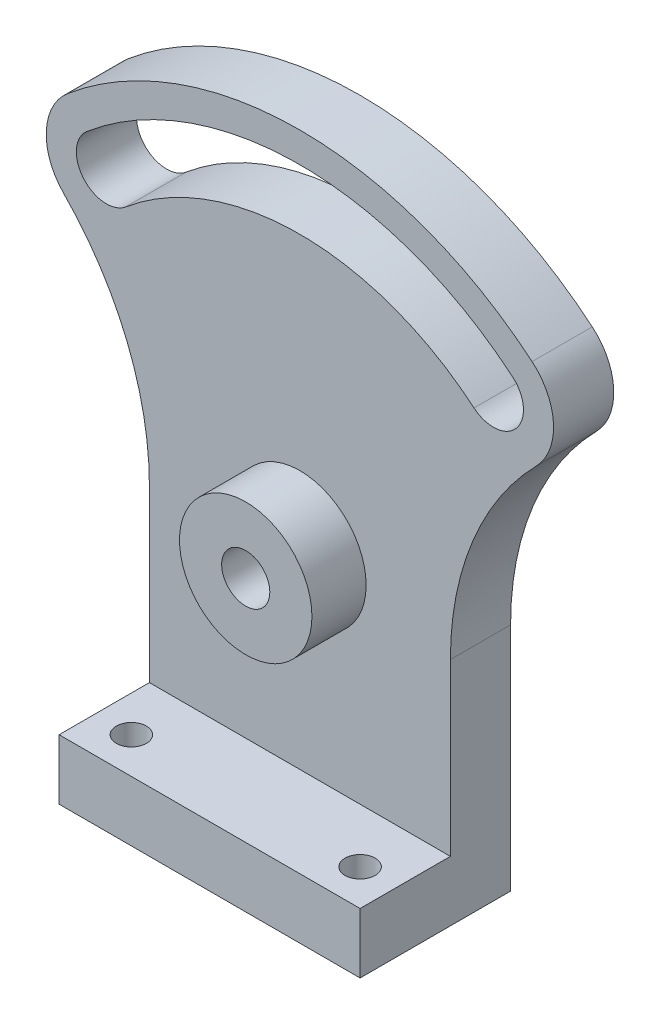
ISO-10303-21;
HEADER;
FILE_DESCRIPTION(('STEP AP214'),'2;1');
FILE_NAME('part.step','',(''),(''),'','','');
FILE_SCHEMA(('AUTOMOTIVE_DESIGN { 1 0 10303 214 1 1 1 1 }'));
ENDSEC;
DATA;
#1=APPLICATION_CONTEXT('core data for automotive mechanical design processes');
#2=APPLICATION_PROTOCOL_DEFINITION('international standard','automotive_design',2000,#1);
#3=PRODUCT_CONTEXT('',#1,'mechanical');
#4=PRODUCT('Part','Part','',(#3));
#5=PRODUCT_RELATED_PRODUCT_CATEGORY('part','',(#4));
#6=PRODUCT_DEFINITION_FORMATION('','',#4);
#7=PRODUCT_DEFINITION_CONTEXT('part definition',#1,'design');
#8=PRODUCT_DEFINITION('design','',#6,#7);
#9=PRODUCT_DEFINITION_SHAPE('','',#8);
#10=(LENGTH_UNIT() NAMED_UNIT(*) SI_UNIT(.MILLI.,.METRE.));
#11=(NAMED_UNIT(*) PLANE_ANGLE_UNIT() SI_UNIT($,.RADIAN.));
#12=(NAMED_UNIT(*) SI_UNIT($,.STERADIAN.) SOLID_ANGLE_UNIT());
#13=UNCERTAINTY_MEASURE_WITH_UNIT(LENGTH_MEASURE(1.E-05),#10,'distance_accuracy_value','');
#14=(GEOMETRIC_REPRESENTATION_CONTEXT(3) GLOBAL_UNCERTAINTY_ASSIGNED_CONTEXT((#13)) GLOBAL_UNIT_ASSIGNED_CONTEXT((#10,
#11,#12)) REPRESENTATION_CONTEXT('',''));
#15=CARTESIAN_POINT('',(0.,0.,0.));
#16=DIRECTION('',(0.,0.,1.));
#17=DIRECTION('',(1.,0.,0.));
#18=AXIS2_PLACEMENT_3D('',#15,#16,#17);
#19=CARTESIAN_POINT('',(0.,-21.,25.));
#20=DIRECTION('',(0.,1.,0.));
#21=DIRECTION('',(0.,0.,1.));
#22=AXIS2_PLACEMENT_3D('',#19,#20,#21);
#23=PLANE('',#22);
#24=CARTESIAN_POINT('',(-19.,-21.,19.));
#25=DIRECTION('',(0.,1.,0.));
#26=DIRECTION('',(0.,0.,1.));
#27=AXIS2_PLACEMENT_3D('',#24,#25,#26);
#28=CIRCLE('',#27,2.49999999999999);
#29=CARTESIAN_POINT('',(-19.,-21.,21.5));
#30=VERTEX_POINT('',#29);
#31=EDGE_CURVE('E321',#30,#30,#28,.T.);
#32=ORIENTED_EDGE('',*,*,#31,.T.);
#33=EDGE_LOOP('',(#32));
#34=FACE_BOUND('',#33,.T.);
#35=CARTESIAN_POINT('',(19.,-21.,19.));
#36=DIRECTION('',(0.,1.,0.));
#37=DIRECTION('',(0.,0.,1.));
#38=AXIS2_PLACEMENT_3D('',#35,#36,#37);
#39=CIRCLE('',#38,2.49999999999999);
#40=CARTESIAN_POINT('',(19.,-21.,21.5));
#41=VERTEX_POINT('',#40);
#42=EDGE_CURVE('E315',#41,#41,#39,.T.);
#43=ORIENTED_EDGE('',*,*,#42,.T.);
#44=EDGE_LOOP('',(#43));
#45=FACE_BOUND('',#44,.T.);
#46=DIRECTION('',(1.,0.,0.));
#47=VECTOR('',#46,1.);
#48=CARTESIAN_POINT('',(0.,-21.,0.));
#49=LINE('',#48,#47);
#50=CARTESIAN_POINT('',(-25.,-21.,0.));
#51=VERTEX_POINT('',#50);
#52=CARTESIAN_POINT('',(25.,-21.,0.));
#53=VERTEX_POINT('',#52);
#54=EDGE_CURVE('E220',#51,#53,#49,.T.);
#55=ORIENTED_EDGE('',*,*,#54,.T.);
#56=DIRECTION('',(0.,0.,-1.));
#57=VECTOR('',#56,1.);
#58=CARTESIAN_POINT('',(25.,-21.,25.));
#59=LINE('',#58,#57);
#60=CARTESIAN_POINT('',(25.,-21.,25.));
#61=VERTEX_POINT('',#60);
#62=EDGE_CURVE('E75',#61,#53,#59,.T.);
#63=ORIENTED_EDGE('',*,*,#62,.F.);
#64=DIRECTION('',(1.,0.,0.));
#65=VECTOR('',#64,1.);
#66=CARTESIAN_POINT('',(0.,-21.,25.));
#67=LINE('',#66,#65);
#68=CARTESIAN_POINT('',(-25.,-21.,25.));
#69=VERTEX_POINT('',#68);
#70=EDGE_CURVE('E211',#69,#61,#67,.T.);
#71=ORIENTED_EDGE('',*,*,#70,.F.);
#72=DIRECTION('',(0.,0.,-1.));
#73=VECTOR('',#72,1.);
#74=CARTESIAN_POINT('',(-25.,-21.,25.));
#75=LINE('',#74,#73);
#76=EDGE_CURVE('E91',#69,#51,#75,.T.);
#77=ORIENTED_EDGE('',*,*,#76,.T.);
#78=EDGE_LOOP('',(#55,#63,#71,#77));
#79=FACE_BOUND('',#78,.T.);
#80=ADVANCED_FACE('F68',(#34,#45,#79),#23,.F.);
#81=CARTESIAN_POINT('',(25.,0.,25.));
#82=DIRECTION('',(-1.,0.,0.));
#83=DIRECTION('',(0.,-1.,0.));
#84=AXIS2_PLACEMENT_3D('',#81,#82,#83);
#85=PLANE('',#84);
#86=DIRECTION('',(0.,1.,0.));
#87=VECTOR('',#86,1.);
#88=CARTESIAN_POINT('',(25.,0.,0.));
#89=LINE('',#88,#87);
#90=CARTESIAN_POINT('',(25.,17.3145180661476,0.));
#91=VERTEX_POINT('',#90);
#92=EDGE_CURVE('E222',#53,#91,#89,.T.);
#93=ORIENTED_EDGE('',*,*,#92,.T.);
#94=DIRECTION('',(0.,0.,-1.));
#95=VECTOR('',#94,1.);
#96=CARTESIAN_POINT('',(25.,17.3145180661476,10.));
#97=LINE('',#96,#95);
#98=CARTESIAN_POINT('',(25.,17.3145180661476,10.));
#99=VERTEX_POINT('',#98);
#100=EDGE_CURVE('E247',#99,#91,#97,.T.);
#101=ORIENTED_EDGE('',*,*,#100,.F.);
#102=DIRECTION('',(0.,1.,0.));
#103=VECTOR('',#102,1.);
#104=CARTESIAN_POINT('',(25.,0.,10.));
#105=LINE('',#104,#103);
#106=CARTESIAN_POINT('',(25.,-11.,10.));
#107=VERTEX_POINT('',#106);
#108=EDGE_CURVE('E194',#107,#99,#105,.T.);
#109=ORIENTED_EDGE('',*,*,#108,.F.);
#110=DIRECTION('',(0.,0.,-1.));
#111=VECTOR('',#110,1.);
#112=CARTESIAN_POINT('',(25.,-11.,25.));
#113=LINE('',#112,#111);
#114=CARTESIAN_POINT('',(25.,-11.,25.));
#115=VERTEX_POINT('',#114);
#116=EDGE_CURVE('E229',#115,#107,#113,.T.);
#117=ORIENTED_EDGE('',*,*,#116,.F.);
#118=DIRECTION('',(0.,1.,0.));
#119=VECTOR('',#118,1.);
#120=CARTESIAN_POINT('',(25.,0.,25.));
#121=LINE('',#120,#119);
#122=EDGE_CURVE('E111',#61,#115,#121,.T.);
#123=ORIENTED_EDGE('',*,*,#122,.F.);
#124=ORIENTED_EDGE('',*,*,#62,.T.);
#125=EDGE_LOOP('',(#93,#101,#109,#117,#123,#124));
#126=FACE_BOUND('',#125,.T.);
#127=ADVANCED_FACE('F231',(#126),#85,.F.);
#128=CARTESIAN_POINT('',(0.,-11.,25.));
#129=DIRECTION('',(0.,1.,0.));
#130=DIRECTION('',(0.,0.,1.));
#131=AXIS2_PLACEMENT_3D('',#128,#129,#130);
#132=PLANE('',#131);
#133=CARTESIAN_POINT('',(-19.,-11.,19.));
#134=DIRECTION('',(0.,1.,0.));
#135=DIRECTION('',(0.,0.,1.));
#136=AXIS2_PLACEMENT_3D('',#133,#134,#135);
#137=CIRCLE('',#136,2.49999999999998);
#138=CARTESIAN_POINT('',(-19.,-11.,21.5));
#139=VERTEX_POINT('',#138);
#140=EDGE_CURVE('E324',#139,#139,#137,.T.);
#141=ORIENTED_EDGE('',*,*,#140,.F.);
#142=EDGE_LOOP('',(#141));
#143=FACE_BOUND('',#142,.T.);
#144=CARTESIAN_POINT('',(19.,-11.,19.));
#145=DIRECTION('',(0.,1.,0.));
#146=DIRECTION('',(0.,0.,1.));
#147=AXIS2_PLACEMENT_3D('',#144,#145,#146);
#148=CIRCLE('',#147,2.49999999999998);
#149=CARTESIAN_POINT('',(19.,-11.,21.5));
#150=VERTEX_POINT('',#149);
#151=EDGE_CURVE('E318',#150,#150,#148,.T.);
#152=ORIENTED_EDGE('',*,*,#151,.F.);
#153=EDGE_LOOP('',(#152));
#154=FACE_BOUND('',#153,.T.);
#155=DIRECTION('',(1.,0.,0.));
#156=VECTOR('',#155,1.);
#157=CARTESIAN_POINT('',(0.,-11.,10.));
#158=LINE('',#157,#156);
#159=CARTESIAN_POINT('',(-25.,-11.,10.));
#160=VERTEX_POINT('',#159);
#161=EDGE_CURVE('E82',#160,#107,#158,.T.);
#162=ORIENTED_EDGE('',*,*,#161,.F.);
#163=DIRECTION('',(0.,0.,-1.));
#164=VECTOR('',#163,1.);
#165=CARTESIAN_POINT('',(-25.,-11.,25.));
#166=LINE('',#165,#164);
#167=CARTESIAN_POINT('',(-25.,-11.,25.));
#168=VERTEX_POINT('',#167);
#169=EDGE_CURVE('E227',#168,#160,#166,.T.);
#170=ORIENTED_EDGE('',*,*,#169,.F.);
#171=DIRECTION('',(1.,0.,0.));
#172=VECTOR('',#171,1.);
#173=CARTESIAN_POINT('',(0.,-11.,25.));
#174=LINE('',#173,#172);
#175=EDGE_CURVE('E215',#168,#115,#174,.T.);
#176=ORIENTED_EDGE('',*,*,#175,.T.);
#177=ORIENTED_EDGE('',*,*,#116,.T.);
#178=EDGE_LOOP('',(#162,#170,#176,#177));
#179=FACE_BOUND('',#178,.T.);
#180=ADVANCED_FACE('F330',(#143,#154,#179),#132,.T.);
#181=CARTESIAN_POINT('',(-25.,0.,25.));
#182=DIRECTION('',(-1.,0.,0.));
#183=DIRECTION('',(0.,-1.,0.));
#184=AXIS2_PLACEMENT_3D('',#181,#182,#183);
#185=PLANE('',#184);
#186=DIRECTION('',(0.,1.,0.));
#187=VECTOR('',#186,1.);
#188=CARTESIAN_POINT('',(-25.,0.,0.));
#189=LINE('',#188,#187);
#190=CARTESIAN_POINT('',(-25.,17.3145180661476,0.));
#191=VERTEX_POINT('',#190);
#192=EDGE_CURVE('E213',#51,#191,#189,.T.);
#193=ORIENTED_EDGE('',*,*,#192,.F.);
#194=ORIENTED_EDGE('',*,*,#76,.F.);
#195=DIRECTION('',(0.,1.,0.));
#196=VECTOR('',#195,1.);
#197=CARTESIAN_POINT('',(-25.,0.,25.));
#198=LINE('',#197,#196);
#199=EDGE_CURVE('E218',#69,#168,#198,.T.);
#200=ORIENTED_EDGE('',*,*,#199,.T.);
#201=ORIENTED_EDGE('',*,*,#169,.T.);
#202=DIRECTION('',(0.,1.,0.));
#203=VECTOR('',#202,1.);
#204=CARTESIAN_POINT('',(-25.,0.,10.));
#205=LINE('',#204,#203);
#206=CARTESIAN_POINT('',(-25.,17.3145180661476,10.));
#207=VERTEX_POINT('',#206);
#208=EDGE_CURVE('E242',#160,#207,#205,.T.);
#209=ORIENTED_EDGE('',*,*,#208,.T.);
#210=DIRECTION('',(0.,0.,-1.));
#211=VECTOR('',#210,1.);
#212=CARTESIAN_POINT('',(-25.,17.3145180661476,10.));
#213=LINE('',#212,#211);
#214=EDGE_CURVE('E239',#207,#191,#213,.T.);
#215=ORIENTED_EDGE('',*,*,#214,.T.);
#216=EDGE_LOOP('',(#193,#194,#200,#201,#209,#215));
#217=FACE_BOUND('',#216,.T.);
#218=ADVANCED_FACE('F237',(#217),#185,.T.);
#219=CARTESIAN_POINT('',(0.,0.,25.));
#220=DIRECTION('',(0.,0.,1.));
#221=DIRECTION('',(1.,0.,0.));
#222=AXIS2_PLACEMENT_3D('',#219,#220,#221);
#223=PLANE('',#222);
#224=ORIENTED_EDGE('',*,*,#70,.T.);
#225=ORIENTED_EDGE('',*,*,#122,.T.);
#226=ORIENTED_EDGE('',*,*,#175,.F.);
#227=ORIENTED_EDGE('',*,*,#199,.F.);
#228=EDGE_LOOP('',(#224,#225,#226,#227));
#229=FACE_BOUND('',#228,.T.);
#230=ADVANCED_FACE('F363',(#229),#223,.T.);
#231=CARTESIAN_POINT('',(0.,0.,0.));
#232=DIRECTION('',(0.,0.,1.));
#233=DIRECTION('',(1.,0.,0.));
#234=AXIS2_PLACEMENT_3D('',#231,#232,#233);
#235=PLANE('',#234);
#236=ORIENTED_EDGE('',*,*,#54,.F.);
#237=ORIENTED_EDGE('',*,*,#192,.T.);
#238=CARTESIAN_POINT('',(-75.,17.3145180661476,0.));
#239=DIRECTION('',(0.,0.,1.));
#240=DIRECTION('',(1.,0.,0.));
#241=AXIS2_PLACEMENT_3D('',#238,#239,#240);
#242=CIRCLE('',#241,50.);
#243=CARTESIAN_POINT('',(-39.2828170702725,52.3042714743153,0.));
#244=VERTEX_POINT('',#243);
#245=EDGE_CURVE('E249',#191,#244,#242,.T.);
#246=ORIENTED_EDGE('',*,*,#245,.T.);
#247=CARTESIAN_POINT('',(-32.139380484327,59.3022221559488,0.));
#248=DIRECTION('',(0.,0.,1.));
#249=DIRECTION('',(1.,0.,0.));
#250=AXIS2_PLACEMENT_3D('',#247,#248,#249);
#251=CIRCLE('',#250,10.);
#252=CARTESIAN_POINT('',(-38.5672565811925,66.9626665871386,0.));
#253=VERTEX_POINT('',#252);
#254=EDGE_CURVE('E255',#253,#244,#251,.T.);
#255=ORIENTED_EDGE('',*,*,#254,.F.);
#256=CARTESIAN_POINT('',(0.,21.,0.));
#257=DIRECTION('',(0.,0.,1.));
#258=DIRECTION('',(1.,0.,0.));
#259=AXIS2_PLACEMENT_3D('',#256,#257,#258);
#260=CIRCLE('',#259,60.);
#261=CARTESIAN_POINT('',(38.5672565811925,66.9626665871386,0.));
#262=VERTEX_POINT('',#261);
#263=EDGE_CURVE('E260',#262,#253,#260,.T.);
#264=ORIENTED_EDGE('',*,*,#263,.F.);
#265=CARTESIAN_POINT('',(32.139380484327,59.3022221559488,0.));
#266=DIRECTION('',(0.,0.,1.));
#267=DIRECTION('',(1.,0.,0.));
#268=AXIS2_PLACEMENT_3D('',#265,#266,#267);
#269=CIRCLE('',#268,10.);
#270=CARTESIAN_POINT('',(39.2828170702725,52.3042714743153,0.));
#271=VERTEX_POINT('',#270);
#272=EDGE_CURVE('E285',#271,#262,#269,.T.);
#273=ORIENTED_EDGE('',*,*,#272,.F.);
#274=CARTESIAN_POINT('',(75.,17.3145180661476,0.));
#275=DIRECTION('',(0.,0.,1.));
#276=DIRECTION('',(1.,0.,0.));
#277=AXIS2_PLACEMENT_3D('',#274,#275,#276);
#278=CIRCLE('',#277,50.);
#279=EDGE_CURVE('E202',#91,#271,#278,.F.);
#280=ORIENTED_EDGE('',*,*,#279,.F.);
#281=ORIENTED_EDGE('',*,*,#92,.F.);
#282=EDGE_LOOP('',(#236,#237,#246,#255,#264,#273,#280,#281));
#283=FACE_BOUND('',#282,.T.);
#284=CARTESIAN_POINT('',(-32.139380484327,59.3022221559488,0.));
#285=DIRECTION('',(0.,0.,1.));
#286=DIRECTION('',(1.,0.,0.));
#287=AXIS2_PLACEMENT_3D('',#284,#285,#286);
#288=CIRCLE('',#287,5.);
#289=CARTESIAN_POINT('',(-35.3533185327598,63.1324443715437,0.));
#290=VERTEX_POINT('',#289);
#291=CARTESIAN_POINT('',(-28.9254424358943,55.471999940354,0.));
#292=VERTEX_POINT('',#291);
#293=EDGE_CURVE('E254',#290,#292,#288,.T.);
#294=ORIENTED_EDGE('',*,*,#293,.T.);
#295=CARTESIAN_POINT('',(0.,21.,0.));
#296=DIRECTION('',(0.,0.,1.));
#297=DIRECTION('',(1.,0.,0.));
#298=AXIS2_PLACEMENT_3D('',#295,#296,#297);
#299=CIRCLE('',#298,45.);
#300=CARTESIAN_POINT('',(28.9254424358943,55.4719999403539,0.));
#301=VERTEX_POINT('',#300);
#302=EDGE_CURVE('E198',#301,#292,#299,.T.);
#303=ORIENTED_EDGE('',*,*,#302,.F.);
#304=CARTESIAN_POINT('',(32.139380484327,59.3022221559488,0.));
#305=DIRECTION('',(0.,0.,1.));
#306=DIRECTION('',(1.,0.,0.));
#307=AXIS2_PLACEMENT_3D('',#304,#305,#306);
#308=CIRCLE('',#307,5.);
#309=CARTESIAN_POINT('',(35.3533185327598,63.1324443715437,0.));
#310=VERTEX_POINT('',#309);
#311=EDGE_CURVE('E266',#301,#310,#308,.T.);
#312=ORIENTED_EDGE('',*,*,#311,.T.);
#313=CARTESIAN_POINT('',(0.,21.,0.));
#314=DIRECTION('',(0.,0.,1.));
#315=DIRECTION('',(1.,0.,0.));
#316=AXIS2_PLACEMENT_3D('',#313,#314,#315);
#317=CIRCLE('',#316,55.);
#318=EDGE_CURVE('E258',#310,#290,#317,.T.);
#319=ORIENTED_EDGE('',*,*,#318,.T.);
#320=EDGE_LOOP('',(#294,#303,#312,#319));
#321=FACE_BOUND('',#320,.T.);
#322=ADVANCED_FACE('F233',(#283,#321),#235,.F.);
#323=CARTESIAN_POINT('',(-32.139380484327,59.3022221559488,10.));
#324=DIRECTION('',(0.,0.,-1.));
#325=DIRECTION('',(-1.,0.,0.));
#326=AXIS2_PLACEMENT_3D('',#323,#324,#325);
#327=CYLINDRICAL_SURFACE('',#326,5.);
#328=ORIENTED_EDGE('',*,*,#293,.F.);
#329=DIRECTION('',(0.,0.,-1.));
#330=VECTOR('',#329,1.);
#331=CARTESIAN_POINT('',(-35.3533185327598,63.1324443715437,10.));
#332=LINE('',#331,#330);
#333=CARTESIAN_POINT('',(-35.3533185327598,63.1324443715437,10.));
#334=VERTEX_POINT('',#333);
#335=EDGE_CURVE('E223',#334,#290,#332,.T.);
#336=ORIENTED_EDGE('',*,*,#335,.F.);
#337=CARTESIAN_POINT('',(-32.139380484327,59.3022221559488,10.));
#338=DIRECTION('',(0.,0.,1.));
#339=DIRECTION('',(1.,0.,0.));
#340=AXIS2_PLACEMENT_3D('',#337,#338,#339);
#341=CIRCLE('',#340,5.);
#342=CARTESIAN_POINT('',(-28.9254424358943,55.471999940354,10.));
#343=VERTEX_POINT('',#342);
#344=EDGE_CURVE('E297',#334,#343,#341,.T.);
#345=ORIENTED_EDGE('',*,*,#344,.T.);
#346=DIRECTION('',(0.,0.,-1.));
#347=VECTOR('',#346,1.);
#348=CARTESIAN_POINT('',(-28.9254424358943,55.471999940354,10.));
#349=LINE('',#348,#347);
#350=EDGE_CURVE('E203',#343,#292,#349,.T.);
#351=ORIENTED_EDGE('',*,*,#350,.T.);
#352=EDGE_LOOP('',(#328,#336,#345,#351));
#353=FACE_BOUND('',#352,.T.);
#354=ADVANCED_FACE('F366',(#353),#327,.F.);
#355=CARTESIAN_POINT('',(0.,21.,10.));
#356=DIRECTION('',(0.,0.,-1.));
#357=DIRECTION('',(-1.,0.,0.));
#358=AXIS2_PLACEMENT_3D('',#355,#356,#357);
#359=CYLINDRICAL_SURFACE('',#358,55.);
#360=ORIENTED_EDGE('',*,*,#318,.F.);
#361=DIRECTION('',(0.,0.,-1.));
#362=VECTOR('',#361,1.);
#363=CARTESIAN_POINT('',(35.3533185327598,63.1324443715437,10.));
#364=LINE('',#363,#362);
#365=CARTESIAN_POINT('',(35.3533185327598,63.1324443715437,10.));
#366=VERTEX_POINT('',#365);
#367=EDGE_CURVE('E272',#366,#310,#364,.T.);
#368=ORIENTED_EDGE('',*,*,#367,.F.);
#369=CARTESIAN_POINT('',(0.,21.,10.));
#370=DIRECTION('',(0.,0.,1.));
#371=DIRECTION('',(1.,0.,0.));
#372=AXIS2_PLACEMENT_3D('',#369,#370,#371);
#373=CIRCLE('',#372,55.);
#374=EDGE_CURVE('E294',#366,#334,#373,.T.);
#375=ORIENTED_EDGE('',*,*,#374,.T.);
#376=ORIENTED_EDGE('',*,*,#335,.T.);
#377=EDGE_LOOP('',(#360,#368,#375,#376));
#378=FACE_BOUND('',#377,.T.);
#379=ADVANCED_FACE('F385',(#378),#359,.F.);
#380=CARTESIAN_POINT('',(32.139380484327,59.3022221559488,10.));
#381=DIRECTION('',(0.,0.,-1.));
#382=DIRECTION('',(-1.,0.,0.));
#383=AXIS2_PLACEMENT_3D('',#380,#381,#382);
#384=CYLINDRICAL_SURFACE('',#383,5.);
#385=ORIENTED_EDGE('',*,*,#311,.F.);
#386=DIRECTION('',(0.,0.,-1.));
#387=VECTOR('',#386,1.);
#388=CARTESIAN_POINT('',(28.9254424358943,55.4719999403539,10.));
#389=LINE('',#388,#387);
#390=CARTESIAN_POINT('',(28.9254424358943,55.4719999403539,10.));
#391=VERTEX_POINT('',#390);
#392=EDGE_CURVE('E205',#391,#301,#389,.T.);
#393=ORIENTED_EDGE('',*,*,#392,.F.);
#394=CARTESIAN_POINT('',(32.139380484327,59.3022221559488,10.));
#395=DIRECTION('',(0.,0.,1.));
#396=DIRECTION('',(1.,0.,0.));
#397=AXIS2_PLACEMENT_3D('',#394,#395,#396);
#398=CIRCLE('',#397,5.);
#399=EDGE_CURVE('E291',#391,#366,#398,.T.);
#400=ORIENTED_EDGE('',*,*,#399,.T.);
#401=ORIENTED_EDGE('',*,*,#367,.T.);
#402=EDGE_LOOP('',(#385,#393,#400,#401));
#403=FACE_BOUND('',#402,.T.);
#404=ADVANCED_FACE('F372',(#403),#384,.F.);
#405=CARTESIAN_POINT('',(75.,17.3145180661476,10.));
#406=DIRECTION('',(0.,0.,-1.));
#407=DIRECTION('',(-1.,0.,0.));
#408=AXIS2_PLACEMENT_3D('',#405,#406,#407);
#409=CYLINDRICAL_SURFACE('',#408,50.);
#410=ORIENTED_EDGE('',*,*,#279,.T.);
#411=DIRECTION('',(0.,0.,-1.));
#412=VECTOR('',#411,1.);
#413=CARTESIAN_POINT('',(39.2828170702725,52.3042714743153,10.));
#414=LINE('',#413,#412);
#415=CARTESIAN_POINT('',(39.2828170702725,52.3042714743153,10.));
#416=VERTEX_POINT('',#415);
#417=EDGE_CURVE('E181',#416,#271,#414,.T.);
#418=ORIENTED_EDGE('',*,*,#417,.F.);
#419=CARTESIAN_POINT('',(75.,17.3145180661476,10.));
#420=DIRECTION('',(0.,0.,1.));
#421=DIRECTION('',(1.,0.,0.));
#422=AXIS2_PLACEMENT_3D('',#419,#420,#421);
#423=CIRCLE('',#422,50.);
#424=EDGE_CURVE('E188',#99,#416,#423,.F.);
#425=ORIENTED_EDGE('',*,*,#424,.F.);
#426=ORIENTED_EDGE('',*,*,#100,.T.);
#427=EDGE_LOOP('',(#410,#418,#425,#426));
#428=FACE_BOUND('',#427,.T.);
#429=ADVANCED_FACE('F200',(#428),#409,.F.);
#430=CARTESIAN_POINT('',(32.139380484327,59.3022221559488,10.));
#431=DIRECTION('',(0.,0.,-1.));
#432=DIRECTION('',(-1.,0.,0.));
#433=AXIS2_PLACEMENT_3D('',#430,#431,#432);
#434=CYLINDRICAL_SURFACE('',#433,10.);
#435=ORIENTED_EDGE('',*,*,#272,.T.);
#436=DIRECTION('',(0.,0.,-1.));
#437=VECTOR('',#436,1.);
#438=CARTESIAN_POINT('',(38.5672565811925,66.9626665871386,10.));
#439=LINE('',#438,#437);
#440=CARTESIAN_POINT('',(38.5672565811925,66.9626665871386,10.));
#441=VERTEX_POINT('',#440);
#442=EDGE_CURVE('E184',#441,#262,#439,.T.);
#443=ORIENTED_EDGE('',*,*,#442,.F.);
#444=CARTESIAN_POINT('',(32.139380484327,59.3022221559488,10.));
#445=DIRECTION('',(0.,0.,1.));
#446=DIRECTION('',(1.,0.,0.));
#447=AXIS2_PLACEMENT_3D('',#444,#445,#446);
#448=CIRCLE('',#447,10.);
#449=EDGE_CURVE('E177',#416,#441,#448,.T.);
#450=ORIENTED_EDGE('',*,*,#449,.F.);
#451=ORIENTED_EDGE('',*,*,#417,.T.);
#452=EDGE_LOOP('',(#435,#443,#450,#451));
#453=FACE_BOUND('',#452,.T.);
#454=ADVANCED_FACE('F179',(#453),#434,.T.);
#455=CARTESIAN_POINT('',(0.,21.,10.));
#456=DIRECTION('',(0.,0.,-1.));
#457=DIRECTION('',(-1.,0.,0.));
#458=AXIS2_PLACEMENT_3D('',#455,#456,#457);
#459=CYLINDRICAL_SURFACE('',#458,60.);
#460=ORIENTED_EDGE('',*,*,#263,.T.);
#461=DIRECTION('',(0.,0.,-1.));
#462=VECTOR('',#461,1.);
#463=CARTESIAN_POINT('',(-38.5672565811925,66.9626665871386,10.));
#464=LINE('',#463,#462);
#465=CARTESIAN_POINT('',(-38.5672565811925,66.9626665871386,10.));
#466=VERTEX_POINT('',#465);
#467=EDGE_CURVE('E207',#466,#253,#464,.T.);
#468=ORIENTED_EDGE('',*,*,#467,.F.);
#469=CARTESIAN_POINT('',(0.,21.,10.));
#470=DIRECTION('',(0.,0.,1.));
#471=DIRECTION('',(1.,0.,0.));
#472=AXIS2_PLACEMENT_3D('',#469,#470,#471);
#473=CIRCLE('',#472,60.);
#474=EDGE_CURVE('E187',#441,#466,#473,.T.);
#475=ORIENTED_EDGE('',*,*,#474,.F.);
#476=ORIENTED_EDGE('',*,*,#442,.T.);
#477=EDGE_LOOP('',(#460,#468,#475,#476));
#478=FACE_BOUND('',#477,.T.);
#479=ADVANCED_FACE('F375',(#478),#459,.T.);
#480=CARTESIAN_POINT('',(-32.139380484327,59.3022221559488,10.));
#481=DIRECTION('',(0.,0.,-1.));
#482=DIRECTION('',(-1.,0.,0.));
#483=AXIS2_PLACEMENT_3D('',#480,#481,#482);
#484=CYLINDRICAL_SURFACE('',#483,10.);
#485=ORIENTED_EDGE('',*,*,#254,.T.);
#486=DIRECTION('',(0.,0.,-1.));
#487=VECTOR('',#486,1.);
#488=CARTESIAN_POINT('',(-39.2828170702725,52.3042714743153,10.));
#489=LINE('',#488,#487);
#490=CARTESIAN_POINT('',(-39.2828170702725,52.3042714743153,10.));
#491=VERTEX_POINT('',#490);
#492=EDGE_CURVE('E246',#491,#244,#489,.T.);
#493=ORIENTED_EDGE('',*,*,#492,.F.);
#494=CARTESIAN_POINT('',(-32.139380484327,59.3022221559488,10.));
#495=DIRECTION('',(0.,0.,1.));
#496=DIRECTION('',(1.,0.,0.));
#497=AXIS2_PLACEMENT_3D('',#494,#495,#496);
#498=CIRCLE('',#497,10.);
#499=EDGE_CURVE('E282',#466,#491,#498,.T.);
#500=ORIENTED_EDGE('',*,*,#499,.F.);
#501=ORIENTED_EDGE('',*,*,#467,.T.);
#502=EDGE_LOOP('',(#485,#493,#500,#501));
#503=FACE_BOUND('',#502,.T.);
#504=ADVANCED_FACE('F281',(#503),#484,.T.);
#505=CARTESIAN_POINT('',(-75.,17.3145180661476,10.));
#506=DIRECTION('',(0.,0.,-1.));
#507=DIRECTION('',(-1.,0.,0.));
#508=AXIS2_PLACEMENT_3D('',#505,#506,#507);
#509=CYLINDRICAL_SURFACE('',#508,50.);
#510=ORIENTED_EDGE('',*,*,#245,.F.);
#511=ORIENTED_EDGE('',*,*,#214,.F.);
#512=CARTESIAN_POINT('',(-75.,17.3145180661476,10.));
#513=DIRECTION('',(0.,0.,1.));
#514=DIRECTION('',(1.,0.,0.));
#515=AXIS2_PLACEMENT_3D('',#512,#513,#514);
#516=CIRCLE('',#515,50.);
#517=EDGE_CURVE('E306',#207,#491,#516,.T.);
#518=ORIENTED_EDGE('',*,*,#517,.T.);
#519=ORIENTED_EDGE('',*,*,#492,.T.);
#520=EDGE_LOOP('',(#510,#511,#518,#519));
#521=FACE_BOUND('',#520,.T.);
#522=ADVANCED_FACE('F250',(#521),#509,.F.);
#523=CARTESIAN_POINT('',(0.,21.,10.));
#524=DIRECTION('',(0.,0.,-1.));
#525=DIRECTION('',(-1.,0.,0.));
#526=AXIS2_PLACEMENT_3D('',#523,#524,#525);
#527=CYLINDRICAL_SURFACE('',#526,45.);
#528=ORIENTED_EDGE('',*,*,#302,.T.);
#529=ORIENTED_EDGE('',*,*,#350,.F.);
#530=CARTESIAN_POINT('',(0.,21.,10.));
#531=DIRECTION('',(0.,0.,1.));
#532=DIRECTION('',(1.,0.,0.));
#533=AXIS2_PLACEMENT_3D('',#530,#531,#532);
#534=CIRCLE('',#533,45.);
#535=EDGE_CURVE('E275',#391,#343,#534,.T.);
#536=ORIENTED_EDGE('',*,*,#535,.F.);
#537=ORIENTED_EDGE('',*,*,#392,.T.);
#538=EDGE_LOOP('',(#528,#529,#536,#537));
#539=FACE_BOUND('',#538,.T.);
#540=ADVANCED_FACE('F382',(#539),#527,.T.);
#541=CARTESIAN_POINT('',(0.,0.,10.));
#542=DIRECTION('',(0.,0.,1.));
#543=DIRECTION('',(1.,0.,0.));
#544=AXIS2_PLACEMENT_3D('',#541,#542,#543);
#545=PLANE('',#544);
#546=ORIENTED_EDGE('',*,*,#424,.T.);
#547=ORIENTED_EDGE('',*,*,#449,.T.);
#548=ORIENTED_EDGE('',*,*,#474,.T.);
#549=ORIENTED_EDGE('',*,*,#499,.T.);
#550=ORIENTED_EDGE('',*,*,#517,.F.);
#551=ORIENTED_EDGE('',*,*,#208,.F.);
#552=ORIENTED_EDGE('',*,*,#161,.T.);
#553=ORIENTED_EDGE('',*,*,#108,.T.);
#554=EDGE_LOOP('',(#546,#547,#548,#549,#550,#551,#552,#553));
#555=FACE_BOUND('',#554,.T.);
#556=CARTESIAN_POINT('',(0.,21.,10.));
#557=DIRECTION('',(0.,0.,1.));
#558=DIRECTION('',(1.,0.,0.));
#559=AXIS2_PLACEMENT_3D('',#556,#557,#558);
#560=CIRCLE('',#559,11.);
#561=CARTESIAN_POINT('',(11.,21.,10.));
#562=VERTEX_POINT('',#561);
#563=EDGE_CURVE('E300',#562,#562,#560,.T.);
#564=ORIENTED_EDGE('',*,*,#563,.F.);
#565=EDGE_LOOP('',(#564));
#566=FACE_BOUND('',#565,.T.);
#567=ORIENTED_EDGE('',*,*,#344,.F.);
#568=ORIENTED_EDGE('',*,*,#374,.F.);
#569=ORIENTED_EDGE('',*,*,#399,.F.);
#570=ORIENTED_EDGE('',*,*,#535,.T.);
#571=EDGE_LOOP('',(#567,#568,#569,#570));
#572=FACE_BOUND('',#571,.T.);
#573=ADVANCED_FACE('F191',(#555,#566,#572),#545,.T.);
#574=CARTESIAN_POINT('',(0.,21.,19.));
#575=DIRECTION('',(0.,0.,-1.));
#576=DIRECTION('',(-1.,0.,0.));
#577=AXIS2_PLACEMENT_3D('',#574,#575,#576);
#578=CYLINDRICAL_SURFACE('',#577,4.);
#579=CARTESIAN_POINT('',(0.,21.,10.));
#580=DIRECTION('',(0.,0.,1.));
#581=DIRECTION('',(1.,0.,0.));
#582=AXIS2_PLACEMENT_3D('',#579,#580,#581);
#583=CIRCLE('',#582,4.);
#584=CARTESIAN_POINT('',(3.99999999999999,21.,10.));
#585=VERTEX_POINT('',#584);
#586=EDGE_CURVE('E12',#585,#585,#583,.T.);
#587=ORIENTED_EDGE('',*,*,#586,.F.);
#588=EDGE_LOOP('',(#587));
#589=FACE_BOUND('',#588,.T.);
#590=CARTESIAN_POINT('',(0.,21.,19.));
#591=DIRECTION('',(0.,0.,1.));
#592=DIRECTION('',(1.,0.,0.));
#593=AXIS2_PLACEMENT_3D('',#590,#591,#592);
#594=CIRCLE('',#593,4.);
#595=CARTESIAN_POINT('',(3.99999999999999,21.,19.));
#596=VERTEX_POINT('',#595);
#597=EDGE_CURVE('E312',#596,#596,#594,.T.);
#598=ORIENTED_EDGE('',*,*,#597,.T.);
#599=EDGE_LOOP('',(#598));
#600=FACE_BOUND('',#599,.T.);
#601=ADVANCED_FACE('F398',(#589,#600),#578,.F.);
#602=CARTESIAN_POINT('',(0.,21.,19.));
#603=DIRECTION('',(0.,0.,-1.));
#604=DIRECTION('',(-1.,0.,0.));
#605=AXIS2_PLACEMENT_3D('',#602,#603,#604);
#606=CYLINDRICAL_SURFACE('',#605,11.);
#607=ORIENTED_EDGE('',*,*,#563,.T.);
#608=EDGE_LOOP('',(#607));
#609=FACE_BOUND('',#608,.T.);
#610=CARTESIAN_POINT('',(0.,21.,19.));
#611=DIRECTION('',(0.,0.,1.));
#612=DIRECTION('',(1.,0.,0.));
#613=AXIS2_PLACEMENT_3D('',#610,#611,#612);
#614=CIRCLE('',#613,11.);
#615=CARTESIAN_POINT('',(11.,21.,19.));
#616=VERTEX_POINT('',#615);
#617=EDGE_CURVE('E289',#616,#616,#614,.T.);
#618=ORIENTED_EDGE('',*,*,#617,.F.);
#619=EDGE_LOOP('',(#618));
#620=FACE_BOUND('',#619,.T.);
#621=ADVANCED_FACE('F401',(#609,#620),#606,.T.);
#622=CARTESIAN_POINT('',(0.,0.,19.));
#623=DIRECTION('',(0.,0.,1.));
#624=DIRECTION('',(1.,0.,0.));
#625=AXIS2_PLACEMENT_3D('',#622,#623,#624);
#626=PLANE('',#625);
#627=ORIENTED_EDGE('',*,*,#597,.F.);
#628=EDGE_LOOP('',(#627));
#629=FACE_BOUND('',#628,.T.);
#630=ORIENTED_EDGE('',*,*,#617,.T.);
#631=EDGE_LOOP('',(#630));
#632=FACE_BOUND('',#631,.T.);
#633=ADVANCED_FACE('F347',(#629,#632),#626,.T.);
#634=CARTESIAN_POINT('',(0.,0.,10.));
#635=DIRECTION('',(0.,0.,1.));
#636=DIRECTION('',(1.,0.,0.));
#637=AXIS2_PLACEMENT_3D('',#634,#635,#636);
#638=PLANE('',#637);
#639=ORIENTED_EDGE('',*,*,#586,.T.);
#640=EDGE_LOOP('',(#639));
#641=FACE_BOUND('',#640,.T.);
#642=ADVANCED_FACE('F338',(#641),#638,.T.);
#643=CARTESIAN_POINT('',(19.,-11.,19.));
#644=DIRECTION('',(0.,1.,0.));
#645=DIRECTION('',(0.,0.,1.));
#646=AXIS2_PLACEMENT_3D('',#643,#644,#645);
#647=CYLINDRICAL_SURFACE('',#646,2.49999999999999);
#648=ORIENTED_EDGE('',*,*,#42,.F.);
#649=EDGE_LOOP('',(#648));
#650=FACE_BOUND('',#649,.T.);
#651=ORIENTED_EDGE('',*,*,#151,.T.);
#652=EDGE_LOOP('',(#651));
#653=FACE_BOUND('',#652,.T.);
#654=ADVANCED_FACE('F336',(#650,#653),#647,.F.);
#655=CARTESIAN_POINT('',(-19.,-11.,19.));
#656=DIRECTION('',(0.,1.,0.));
#657=DIRECTION('',(0.,0.,1.));
#658=AXIS2_PLACEMENT_3D('',#655,#656,#657);
#659=CYLINDRICAL_SURFACE('',#658,2.49999999999999);
#660=ORIENTED_EDGE('',*,*,#31,.F.);
#661=EDGE_LOOP('',(#660));
#662=FACE_BOUND('',#661,.T.);
#663=ORIENTED_EDGE('',*,*,#140,.T.);
#664=EDGE_LOOP('',(#663));
#665=FACE_BOUND('',#664,.T.);
#666=ADVANCED_FACE('F328',(#662,#665),#659,.F.);
#667=CLOSED_SHELL('',(#80,#127,#180,#218,#230,#322,#354,#379,#404,#429,#454,#479,#504,#522,#540,
#573,#601,#621,#633,#642,#654,#666));
#668=MANIFOLD_SOLID_BREP('B2',#667);
#669=ADVANCED_BREP_SHAPE_REPRESENTATION('',(#18,#668),#14);
#670=SHAPE_DEFINITION_REPRESENTATION(#9,#669);
ENDSEC;
END-ISO-10303-21;
